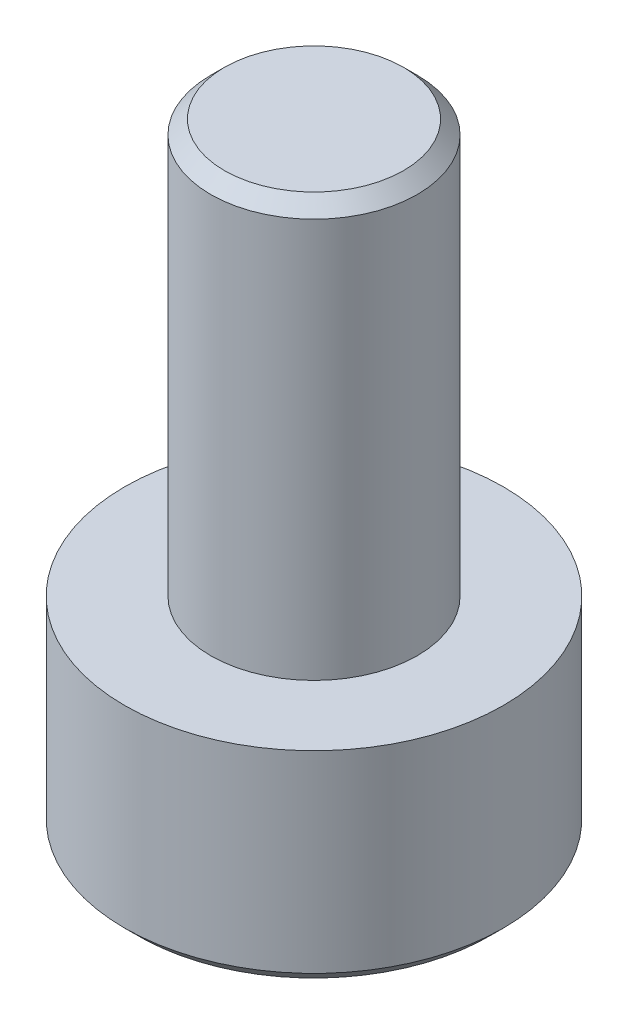
ISO-10303-21;
HEADER;
FILE_DESCRIPTION(('STEP AP214'),'2;1');
FILE_NAME('part.step','',(''),(''),'','','');
FILE_SCHEMA(('AUTOMOTIVE_DESIGN { 1 0 10303 214 1 1 1 1 }'));
ENDSEC;
DATA;
#1=APPLICATION_CONTEXT('core data for automotive mechanical design processes');
#2=APPLICATION_PROTOCOL_DEFINITION('international standard','automotive_design',2000,#1);
#3=PRODUCT_CONTEXT('',#1,'mechanical');
#4=PRODUCT('Part','Part','',(#3));
#5=PRODUCT_RELATED_PRODUCT_CATEGORY('part','',(#4));
#6=PRODUCT_DEFINITION_FORMATION('','',#4);
#7=PRODUCT_DEFINITION_CONTEXT('part definition',#1,'design');
#8=PRODUCT_DEFINITION('design','',#6,#7);
#9=PRODUCT_DEFINITION_SHAPE('','',#8);
#10=(LENGTH_UNIT() NAMED_UNIT(*) SI_UNIT(.MILLI.,.METRE.));
#11=(NAMED_UNIT(*) PLANE_ANGLE_UNIT() SI_UNIT($,.RADIAN.));
#12=(NAMED_UNIT(*) SI_UNIT($,.STERADIAN.) SOLID_ANGLE_UNIT());
#13=UNCERTAINTY_MEASURE_WITH_UNIT(LENGTH_MEASURE(1.E-05),#10,'distance_accuracy_value','');
#14=(GEOMETRIC_REPRESENTATION_CONTEXT(3) GLOBAL_UNCERTAINTY_ASSIGNED_CONTEXT((#13)) GLOBAL_UNIT_ASSIGNED_CONTEXT((#10,
#11,#12)) REPRESENTATION_CONTEXT('',''));
#15=CARTESIAN_POINT('',(0.,0.,0.));
#16=DIRECTION('',(0.,0.,1.));
#17=DIRECTION('',(1.,0.,0.));
#18=AXIS2_PLACEMENT_3D('',#15,#16,#17);
#19=CARTESIAN_POINT('',(0.,-3.,0.));
#20=DIRECTION('',(0.,-1.,0.));
#21=DIRECTION('',(0.,0.,-1.));
#22=AXIS2_PLACEMENT_3D('',#19,#20,#21);
#23=PLANE('',#22);
#24=CARTESIAN_POINT('',(0.,-3.,0.));
#25=DIRECTION('',(0.,-1.,0.));
#26=DIRECTION('',(0.,0.,-1.));
#27=AXIS2_PLACEMENT_3D('',#24,#25,#26);
#28=CIRCLE('',#27,2.55);
#29=CARTESIAN_POINT('',(0.,-3.,-2.55));
#30=VERTEX_POINT('',#29);
#31=EDGE_CURVE('E11',#30,#30,#28,.T.);
#32=ORIENTED_EDGE('',*,*,#31,.T.);
#33=EDGE_LOOP('',(#32));
#34=FACE_BOUND('',#33,.T.);
#35=DIRECTION('',(0.5,0.,-0.866025403784439));
#36=VECTOR('',#35,1.);
#37=CARTESIAN_POINT('',(1.44337567297406,-3.,0.));
#38=LINE('',#37,#36);
#39=CARTESIAN_POINT('',(0.721687836487032,-3.,1.25));
#40=VERTEX_POINT('',#39);
#41=CARTESIAN_POINT('',(1.44337567297406,-3.,0.));
#42=VERTEX_POINT('',#41);
#43=EDGE_CURVE('E131',#40,#42,#38,.T.);
#44=ORIENTED_EDGE('',*,*,#43,.T.);
#45=DIRECTION('',(-0.5,0.,-0.866025403784439));
#46=VECTOR('',#45,1.);
#47=CARTESIAN_POINT('',(0.721687836487032,-3.,-1.25));
#48=LINE('',#47,#46);
#49=CARTESIAN_POINT('',(0.721687836487032,-3.,-1.25));
#50=VERTEX_POINT('',#49);
#51=EDGE_CURVE('E51',#42,#50,#48,.T.);
#52=ORIENTED_EDGE('',*,*,#51,.T.);
#53=DIRECTION('',(-1.,0.,0.));
#54=VECTOR('',#53,1.);
#55=CARTESIAN_POINT('',(-0.721687836487033,-3.,-1.25));
#56=LINE('',#55,#54);
#57=CARTESIAN_POINT('',(-0.721687836487033,-3.,-1.25));
#58=VERTEX_POINT('',#57);
#59=EDGE_CURVE('E122',#50,#58,#56,.T.);
#60=ORIENTED_EDGE('',*,*,#59,.T.);
#61=DIRECTION('',(-0.5,0.,0.866025403784439));
#62=VECTOR('',#61,1.);
#63=CARTESIAN_POINT('',(-1.44337567297406,-3.,0.));
#64=LINE('',#63,#62);
#65=CARTESIAN_POINT('',(-1.44337567297406,-3.,0.));
#66=VERTEX_POINT('',#65);
#67=EDGE_CURVE('E125',#58,#66,#64,.T.);
#68=ORIENTED_EDGE('',*,*,#67,.T.);
#69=DIRECTION('',(0.5,0.,0.866025403784439));
#70=VECTOR('',#69,1.);
#71=CARTESIAN_POINT('',(-0.721687836487032,-3.,1.25));
#72=LINE('',#71,#70);
#73=CARTESIAN_POINT('',(-0.721687836487032,-3.,1.25));
#74=VERTEX_POINT('',#73);
#75=EDGE_CURVE('E128',#66,#74,#72,.T.);
#76=ORIENTED_EDGE('',*,*,#75,.T.);
#77=DIRECTION('',(1.,0.,0.));
#78=VECTOR('',#77,1.);
#79=CARTESIAN_POINT('',(0.721687836487032,-3.,1.25));
#80=LINE('',#79,#78);
#81=EDGE_CURVE('E112',#74,#40,#80,.T.);
#82=ORIENTED_EDGE('',*,*,#81,.T.);
#83=EDGE_LOOP('',(#44,#52,#60,#68,#76,#82));
#84=FACE_BOUND('',#83,.T.);
#85=ADVANCED_FACE('F37',(#34,#84),#23,.T.);
#86=CARTESIAN_POINT('',(0.,-3.,0.));
#87=DIRECTION('',(0.,1.,0.));
#88=DIRECTION('',(0.,0.,1.));
#89=AXIS2_PLACEMENT_3D('',#86,#87,#88);
#90=CONICAL_SURFACE('',#89,2.55,0.785398163397504);
#91=CARTESIAN_POINT('',(0.,-2.80000000000002,0.));
#92=DIRECTION('',(0.,-1.,0.));
#93=DIRECTION('',(0.,0.,-1.));
#94=AXIS2_PLACEMENT_3D('',#91,#92,#93);
#95=CIRCLE('',#94,2.75);
#96=CARTESIAN_POINT('',(0.,-2.80000000000002,-2.75));
#97=VERTEX_POINT('',#96);
#98=EDGE_CURVE('E44',#97,#97,#95,.T.);
#99=ORIENTED_EDGE('',*,*,#98,.T.);
#100=EDGE_LOOP('',(#99));
#101=FACE_BOUND('',#100,.T.);
#102=ORIENTED_EDGE('',*,*,#31,.F.);
#103=EDGE_LOOP('',(#102));
#104=FACE_BOUND('',#103,.T.);
#105=ADVANCED_FACE('F156',(#101,#104),#90,.T.);
#106=CARTESIAN_POINT('',(0.,-500.,0.));
#107=DIRECTION('',(0.,-1.,0.));
#108=DIRECTION('',(0.,0.,-1.));
#109=AXIS2_PLACEMENT_3D('',#106,#107,#108);
#110=CYLINDRICAL_SURFACE('',#109,2.75);
#111=CARTESIAN_POINT('',(0.,0.,0.));
#112=DIRECTION('',(0.,-1.,0.));
#113=DIRECTION('',(0.,0.,-1.));
#114=AXIS2_PLACEMENT_3D('',#111,#112,#113);
#115=CIRCLE('',#114,2.75);
#116=CARTESIAN_POINT('',(0.,0.,-2.75));
#117=VERTEX_POINT('',#116);
#118=EDGE_CURVE('E151',#117,#117,#115,.T.);
#119=ORIENTED_EDGE('',*,*,#118,.T.);
#120=EDGE_LOOP('',(#119));
#121=FACE_BOUND('',#120,.T.);
#122=ORIENTED_EDGE('',*,*,#98,.F.);
#123=EDGE_LOOP('',(#122));
#124=FACE_BOUND('',#123,.T.);
#125=ADVANCED_FACE('F159',(#121,#124),#110,.T.);
#126=CARTESIAN_POINT('',(2.75,0.,0.));
#127=DIRECTION('',(0.,1.,0.));
#128=DIRECTION('',(0.,0.,1.));
#129=AXIS2_PLACEMENT_3D('',#126,#127,#128);
#130=PLANE('',#129);
#131=CARTESIAN_POINT('',(0.,0.,0.));
#132=DIRECTION('',(0.,-1.,0.));
#133=DIRECTION('',(0.,0.,-1.));
#134=AXIS2_PLACEMENT_3D('',#131,#132,#133);
#135=CIRCLE('',#134,1.5);
#136=CARTESIAN_POINT('',(0.,0.,-1.5));
#137=VERTEX_POINT('',#136);
#138=EDGE_CURVE('E148',#137,#137,#135,.T.);
#139=ORIENTED_EDGE('',*,*,#138,.T.);
#140=EDGE_LOOP('',(#139));
#141=FACE_BOUND('',#140,.T.);
#142=ORIENTED_EDGE('',*,*,#118,.F.);
#143=EDGE_LOOP('',(#142));
#144=FACE_BOUND('',#143,.T.);
#145=ADVANCED_FACE('F161',(#141,#144),#130,.T.);
#146=CARTESIAN_POINT('',(0.,-500.,0.));
#147=DIRECTION('',(0.,-1.,0.));
#148=DIRECTION('',(0.,0.,-1.));
#149=AXIS2_PLACEMENT_3D('',#146,#147,#148);
#150=CYLINDRICAL_SURFACE('',#149,1.5);
#151=CARTESIAN_POINT('',(0.,5.80000000000003,0.));
#152=DIRECTION('',(0.,-1.,0.));
#153=DIRECTION('',(0.,0.,-1.));
#154=AXIS2_PLACEMENT_3D('',#151,#152,#153);
#155=CIRCLE('',#154,1.5);
#156=CARTESIAN_POINT('',(0.,5.80000000000003,-1.5));
#157=VERTEX_POINT('',#156);
#158=EDGE_CURVE('E145',#157,#157,#155,.T.);
#159=ORIENTED_EDGE('',*,*,#158,.T.);
#160=EDGE_LOOP('',(#159));
#161=FACE_BOUND('',#160,.T.);
#162=ORIENTED_EDGE('',*,*,#138,.F.);
#163=EDGE_LOOP('',(#162));
#164=FACE_BOUND('',#163,.T.);
#165=ADVANCED_FACE('F168',(#161,#164),#150,.T.);
#166=CARTESIAN_POINT('',(0.,5.80000000000003,0.));
#167=DIRECTION('',(0.,-1.,0.));
#168=DIRECTION('',(0.,0.,-1.));
#169=AXIS2_PLACEMENT_3D('',#166,#167,#168);
#170=CONICAL_SURFACE('',#169,1.5,0.785398163397504);
#171=CARTESIAN_POINT('',(0.,6.00000000000001,0.));
#172=DIRECTION('',(0.,-1.,0.));
#173=DIRECTION('',(0.,0.,-1.));
#174=AXIS2_PLACEMENT_3D('',#171,#172,#173);
#175=CIRCLE('',#174,1.3);
#176=CARTESIAN_POINT('',(0.,6.00000000000001,-1.3));
#177=VERTEX_POINT('',#176);
#178=EDGE_CURVE('E142',#177,#177,#175,.T.);
#179=ORIENTED_EDGE('',*,*,#178,.T.);
#180=EDGE_LOOP('',(#179));
#181=FACE_BOUND('',#180,.T.);
#182=ORIENTED_EDGE('',*,*,#158,.F.);
#183=EDGE_LOOP('',(#182));
#184=FACE_BOUND('',#183,.T.);
#185=ADVANCED_FACE('F201',(#181,#184),#170,.T.);
#186=CARTESIAN_POINT('',(1.3,6.,0.));
#187=DIRECTION('',(0.,1.,0.));
#188=DIRECTION('',(0.,0.,1.));
#189=AXIS2_PLACEMENT_3D('',#186,#187,#188);
#190=PLANE('',#189);
#191=ORIENTED_EDGE('',*,*,#178,.F.);
#192=EDGE_LOOP('',(#191));
#193=FACE_BOUND('',#192,.T.);
#194=ADVANCED_FACE('F195',(#193),#190,.T.);
#195=CARTESIAN_POINT('',(0.721687836487032,-1.5,-1.25));
#196=DIRECTION('',(-0.866025403784439,0.,0.5));
#197=DIRECTION('',(0.5,0.,0.866025403784439));
#198=AXIS2_PLACEMENT_3D('',#195,#196,#197);
#199=PLANE('',#198);
#200=ORIENTED_EDGE('',*,*,#51,.F.);
#201=DIRECTION('',(0.,-1.,0.));
#202=VECTOR('',#201,1.);
#203=CARTESIAN_POINT('',(1.44337567297406,-1.5,0.));
#204=LINE('',#203,#202);
#205=CARTESIAN_POINT('',(1.44337567297406,-1.5,0.));
#206=VERTEX_POINT('',#205);
#207=EDGE_CURVE('E117',#206,#42,#204,.T.);
#208=ORIENTED_EDGE('',*,*,#207,.F.);
#209=DIRECTION('',(-0.5,0.,-0.866025403784439));
#210=VECTOR('',#209,1.);
#211=CARTESIAN_POINT('',(0.721687836487032,-1.5,-1.25));
#212=LINE('',#211,#210);
#213=CARTESIAN_POINT('',(0.721687836487032,-1.5,-1.25));
#214=VERTEX_POINT('',#213);
#215=EDGE_CURVE('E134',#206,#214,#212,.T.);
#216=ORIENTED_EDGE('',*,*,#215,.T.);
#217=DIRECTION('',(0.,-1.,0.));
#218=VECTOR('',#217,1.);
#219=CARTESIAN_POINT('',(0.721687836487032,-1.5,-1.25));
#220=LINE('',#219,#218);
#221=EDGE_CURVE('E140',#214,#50,#220,.T.);
#222=ORIENTED_EDGE('',*,*,#221,.T.);
#223=EDGE_LOOP('',(#200,#208,#216,#222));
#224=FACE_BOUND('',#223,.T.);
#225=ADVANCED_FACE('F178',(#224),#199,.T.);
#226=CARTESIAN_POINT('',(-0.721687836487033,-1.5,-1.25));
#227=DIRECTION('',(0.,0.,1.));
#228=DIRECTION('',(1.,0.,0.));
#229=AXIS2_PLACEMENT_3D('',#226,#227,#228);
#230=PLANE('',#229);
#231=ORIENTED_EDGE('',*,*,#59,.F.);
#232=ORIENTED_EDGE('',*,*,#221,.F.);
#233=DIRECTION('',(-1.,0.,0.));
#234=VECTOR('',#233,1.);
#235=CARTESIAN_POINT('',(-0.721687836487033,-1.5,-1.25));
#236=LINE('',#235,#234);
#237=CARTESIAN_POINT('',(-0.721687836487033,-1.5,-1.25));
#238=VERTEX_POINT('',#237);
#239=EDGE_CURVE('E90',#214,#238,#236,.T.);
#240=ORIENTED_EDGE('',*,*,#239,.T.);
#241=DIRECTION('',(0.,-1.,0.));
#242=VECTOR('',#241,1.);
#243=CARTESIAN_POINT('',(-0.721687836487033,-1.5,-1.25));
#244=LINE('',#243,#242);
#245=EDGE_CURVE('E138',#238,#58,#244,.T.);
#246=ORIENTED_EDGE('',*,*,#245,.T.);
#247=EDGE_LOOP('',(#231,#232,#240,#246));
#248=FACE_BOUND('',#247,.T.);
#249=ADVANCED_FACE('F187',(#248),#230,.T.);
#250=CARTESIAN_POINT('',(-1.44337567297406,-1.5,0.));
#251=DIRECTION('',(0.866025403784439,0.,0.5));
#252=DIRECTION('',(0.5,0.,-0.866025403784439));
#253=AXIS2_PLACEMENT_3D('',#250,#251,#252);
#254=PLANE('',#253);
#255=ORIENTED_EDGE('',*,*,#67,.F.);
#256=ORIENTED_EDGE('',*,*,#245,.F.);
#257=DIRECTION('',(-0.5,0.,0.866025403784439));
#258=VECTOR('',#257,1.);
#259=CARTESIAN_POINT('',(-1.44337567297406,-1.5,0.));
#260=LINE('',#259,#258);
#261=CARTESIAN_POINT('',(-1.44337567297406,-1.5,0.));
#262=VERTEX_POINT('',#261);
#263=EDGE_CURVE('E108',#238,#262,#260,.T.);
#264=ORIENTED_EDGE('',*,*,#263,.T.);
#265=DIRECTION('',(0.,-1.,0.));
#266=VECTOR('',#265,1.);
#267=CARTESIAN_POINT('',(-1.44337567297406,-1.5,0.));
#268=LINE('',#267,#266);
#269=EDGE_CURVE('E105',#262,#66,#268,.T.);
#270=ORIENTED_EDGE('',*,*,#269,.T.);
#271=EDGE_LOOP('',(#255,#256,#264,#270));
#272=FACE_BOUND('',#271,.T.);
#273=ADVANCED_FACE('F185',(#272),#254,.T.);
#274=CARTESIAN_POINT('',(-0.721687836487032,-1.5,1.25));
#275=DIRECTION('',(0.866025403784438,0.,-0.5));
#276=DIRECTION('',(-0.5,0.,-0.866025403784439));
#277=AXIS2_PLACEMENT_3D('',#274,#275,#276);
#278=PLANE('',#277);
#279=ORIENTED_EDGE('',*,*,#75,.F.);
#280=ORIENTED_EDGE('',*,*,#269,.F.);
#281=DIRECTION('',(0.5,0.,0.866025403784439));
#282=VECTOR('',#281,1.);
#283=CARTESIAN_POINT('',(-0.721687836487032,-1.5,1.25));
#284=LINE('',#283,#282);
#285=CARTESIAN_POINT('',(-0.721687836487032,-1.5,1.25));
#286=VERTEX_POINT('',#285);
#287=EDGE_CURVE('E100',#262,#286,#284,.T.);
#288=ORIENTED_EDGE('',*,*,#287,.T.);
#289=DIRECTION('',(0.,-1.,0.));
#290=VECTOR('',#289,1.);
#291=CARTESIAN_POINT('',(-0.721687836487032,-1.5,1.25));
#292=LINE('',#291,#290);
#293=EDGE_CURVE('E104',#286,#74,#292,.T.);
#294=ORIENTED_EDGE('',*,*,#293,.T.);
#295=EDGE_LOOP('',(#279,#280,#288,#294));
#296=FACE_BOUND('',#295,.T.);
#297=ADVANCED_FACE('F103',(#296),#278,.T.);
#298=CARTESIAN_POINT('',(0.721687836487032,-1.5,1.25));
#299=DIRECTION('',(0.,0.,-1.));
#300=DIRECTION('',(-1.,0.,0.));
#301=AXIS2_PLACEMENT_3D('',#298,#299,#300);
#302=PLANE('',#301);
#303=ORIENTED_EDGE('',*,*,#81,.F.);
#304=ORIENTED_EDGE('',*,*,#293,.F.);
#305=DIRECTION('',(1.,0.,0.));
#306=VECTOR('',#305,1.);
#307=CARTESIAN_POINT('',(0.721687836487032,-1.5,1.25));
#308=LINE('',#307,#306);
#309=CARTESIAN_POINT('',(0.721687836487032,-1.5,1.25));
#310=VERTEX_POINT('',#309);
#311=EDGE_CURVE('E107',#286,#310,#308,.T.);
#312=ORIENTED_EDGE('',*,*,#311,.T.);
#313=DIRECTION('',(0.,-1.,0.));
#314=VECTOR('',#313,1.);
#315=CARTESIAN_POINT('',(0.721687836487032,-1.5,1.25));
#316=LINE('',#315,#314);
#317=EDGE_CURVE('E81',#310,#40,#316,.T.);
#318=ORIENTED_EDGE('',*,*,#317,.T.);
#319=EDGE_LOOP('',(#303,#304,#312,#318));
#320=FACE_BOUND('',#319,.T.);
#321=ADVANCED_FACE('F110',(#320),#302,.T.);
#322=CARTESIAN_POINT('',(1.44337567297406,-1.5,0.));
#323=DIRECTION('',(-0.866025403784439,0.,-0.5));
#324=DIRECTION('',(-0.5,0.,0.866025403784439));
#325=AXIS2_PLACEMENT_3D('',#322,#323,#324);
#326=PLANE('',#325);
#327=ORIENTED_EDGE('',*,*,#43,.F.);
#328=ORIENTED_EDGE('',*,*,#317,.F.);
#329=DIRECTION('',(0.5,0.,-0.866025403784439));
#330=VECTOR('',#329,1.);
#331=CARTESIAN_POINT('',(1.44337567297406,-1.5,0.));
#332=LINE('',#331,#330);
#333=EDGE_CURVE('E59',#310,#206,#332,.T.);
#334=ORIENTED_EDGE('',*,*,#333,.T.);
#335=ORIENTED_EDGE('',*,*,#207,.T.);
#336=EDGE_LOOP('',(#327,#328,#334,#335));
#337=FACE_BOUND('',#336,.T.);
#338=ADVANCED_FACE('F177',(#337),#326,.T.);
#339=CARTESIAN_POINT('',(0.,-1.5,0.));
#340=DIRECTION('',(0.,-1.,0.));
#341=DIRECTION('',(0.,0.,-1.));
#342=AXIS2_PLACEMENT_3D('',#339,#340,#341);
#343=PLANE('',#342);
#344=ORIENTED_EDGE('',*,*,#215,.F.);
#345=ORIENTED_EDGE('',*,*,#333,.F.);
#346=ORIENTED_EDGE('',*,*,#311,.F.);
#347=ORIENTED_EDGE('',*,*,#287,.F.);
#348=ORIENTED_EDGE('',*,*,#263,.F.);
#349=ORIENTED_EDGE('',*,*,#239,.F.);
#350=EDGE_LOOP('',(#344,#345,#346,#347,#348,#349));
#351=FACE_BOUND('',#350,.T.);
#352=ADVANCED_FACE('F115',(#351),#343,.T.);
#353=CLOSED_SHELL('',(#85,#105,#125,#145,#165,#185,#194,#225,#249,#273,#297,#321,#338,#352));
#354=MANIFOLD_SOLID_BREP('B2',#353);
#355=ADVANCED_BREP_SHAPE_REPRESENTATION('',(#18,#354),#14);
#356=SHAPE_DEFINITION_REPRESENTATION(#9,#355);
ENDSEC;
END-ISO-10303-21;
